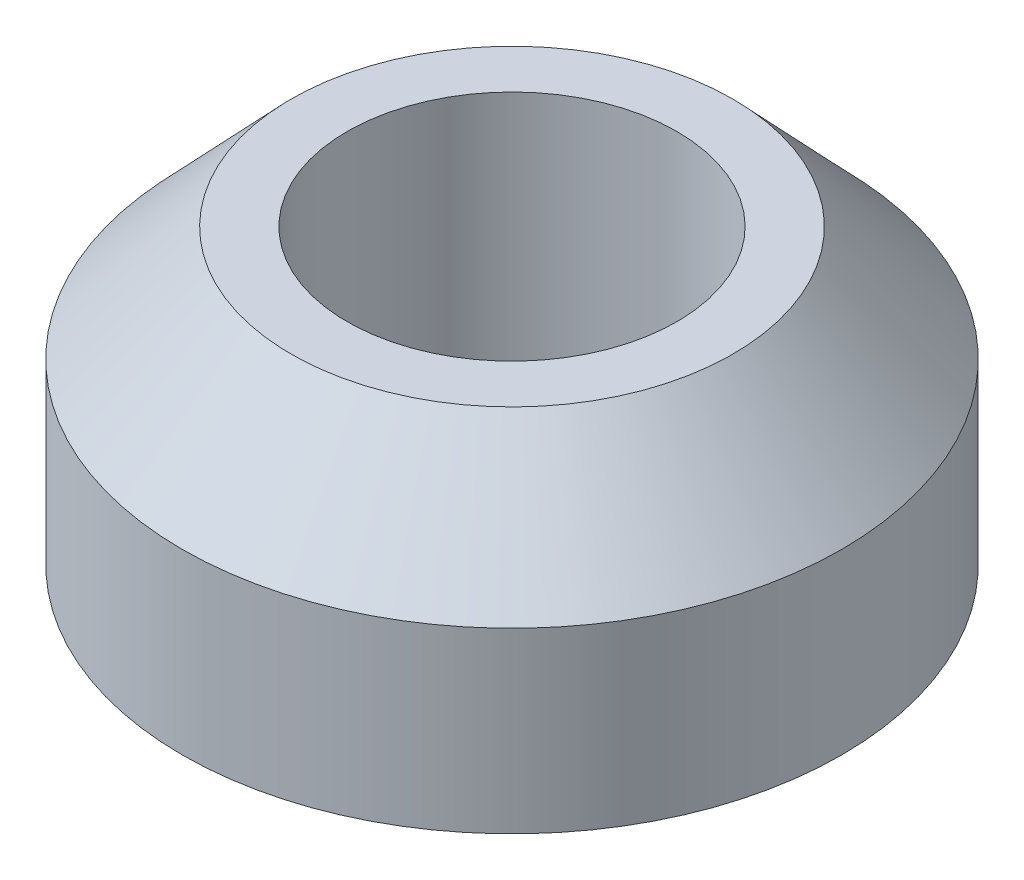
ISO-10303-21;
HEADER;
FILE_DESCRIPTION(('STEP AP214'),'2;1');
FILE_NAME('part.step','',(''),(''),'','','');
FILE_SCHEMA(('AUTOMOTIVE_DESIGN { 1 0 10303 214 1 1 1 1 }'));
ENDSEC;
DATA;
#1=APPLICATION_CONTEXT('core data for automotive mechanical design processes');
#2=APPLICATION_PROTOCOL_DEFINITION('international standard','automotive_design',2000,#1);
#3=PRODUCT_CONTEXT('',#1,'mechanical');
#4=PRODUCT('Part','Part','',(#3));
#5=PRODUCT_RELATED_PRODUCT_CATEGORY('part','',(#4));
#6=PRODUCT_DEFINITION_FORMATION('','',#4);
#7=PRODUCT_DEFINITION_CONTEXT('part definition',#1,'design');
#8=PRODUCT_DEFINITION('design','',#6,#7);
#9=PRODUCT_DEFINITION_SHAPE('','',#8);
#10=(LENGTH_UNIT() NAMED_UNIT(*) SI_UNIT(.MILLI.,.METRE.));
#11=(NAMED_UNIT(*) PLANE_ANGLE_UNIT() SI_UNIT($,.RADIAN.));
#12=(NAMED_UNIT(*) SI_UNIT($,.STERADIAN.) SOLID_ANGLE_UNIT());
#13=UNCERTAINTY_MEASURE_WITH_UNIT(LENGTH_MEASURE(1.E-05),#10,'distance_accuracy_value','');
#14=(GEOMETRIC_REPRESENTATION_CONTEXT(3) GLOBAL_UNCERTAINTY_ASSIGNED_CONTEXT((#13)) GLOBAL_UNIT_ASSIGNED_CONTEXT((#10,
#11,#12)) REPRESENTATION_CONTEXT('',''));
#15=CARTESIAN_POINT('',(0.,0.,0.));
#16=DIRECTION('',(0.,0.,1.));
#17=DIRECTION('',(1.,0.,0.));
#18=AXIS2_PLACEMENT_3D('',#15,#16,#17);
#19=CARTESIAN_POINT('',(0.,0.,-6.35));
#20=DIRECTION('',(0.,-1.,0.));
#21=DIRECTION('',(0.,0.,-1.));
#22=AXIS2_PLACEMENT_3D('',#19,#20,#21);
#23=PLANE('',#22);
#24=CARTESIAN_POINT('',(0.,0.,0.));
#25=DIRECTION('',(0.,-1.,0.));
#26=DIRECTION('',(0.,0.,-1.));
#27=AXIS2_PLACEMENT_3D('',#24,#25,#26);
#28=CIRCLE('',#27,6.35);
#29=CARTESIAN_POINT('',(0.,0.,-6.35));
#30=VERTEX_POINT('',#29);
#31=EDGE_CURVE('E66',#30,#30,#28,.T.);
#32=ORIENTED_EDGE('',*,*,#31,.T.);
#33=EDGE_LOOP('',(#32));
#34=FACE_BOUND('',#33,.T.);
#35=CARTESIAN_POINT('',(0.,0.,0.));
#36=DIRECTION('',(0.,-1.,0.));
#37=DIRECTION('',(0.,0.,-1.));
#38=AXIS2_PLACEMENT_3D('',#35,#36,#37);
#39=CIRCLE('',#38,3.175);
#40=CARTESIAN_POINT('',(0.,0.,-3.175));
#41=VERTEX_POINT('',#40);
#42=EDGE_CURVE('E10',#41,#41,#39,.T.);
#43=ORIENTED_EDGE('',*,*,#42,.F.);
#44=EDGE_LOOP('',(#43));
#45=FACE_BOUND('',#44,.T.);
#46=ADVANCED_FACE('F43',(#34,#45),#23,.T.);
#47=CARTESIAN_POINT('',(0.,0.,0.));
#48=DIRECTION('',(0.,-1.,0.));
#49=DIRECTION('',(0.,0.,-1.));
#50=AXIS2_PLACEMENT_3D('',#47,#48,#49);
#51=CYLINDRICAL_SURFACE('',#50,3.175);
#52=ORIENTED_EDGE('',*,*,#42,.T.);
#53=EDGE_LOOP('',(#52));
#54=FACE_BOUND('',#53,.T.);
#55=CARTESIAN_POINT('',(0.,5.6388,0.));
#56=DIRECTION('',(0.,-1.,0.));
#57=DIRECTION('',(0.,0.,-1.));
#58=AXIS2_PLACEMENT_3D('',#55,#56,#57);
#59=CIRCLE('',#58,3.175);
#60=CARTESIAN_POINT('',(0.,5.6388,-3.175));
#61=VERTEX_POINT('',#60);
#62=EDGE_CURVE('E50',#61,#61,#59,.T.);
#63=ORIENTED_EDGE('',*,*,#62,.F.);
#64=EDGE_LOOP('',(#63));
#65=FACE_BOUND('',#64,.T.);
#66=ADVANCED_FACE('F85',(#54,#65),#51,.F.);
#67=CARTESIAN_POINT('',(0.,5.6388,-3.175));
#68=DIRECTION('',(0.,1.,0.));
#69=DIRECTION('',(0.,0.,1.));
#70=AXIS2_PLACEMENT_3D('',#67,#68,#69);
#71=PLANE('',#70);
#72=ORIENTED_EDGE('',*,*,#62,.T.);
#73=EDGE_LOOP('',(#72));
#74=FACE_BOUND('',#73,.T.);
#75=CARTESIAN_POINT('',(0.,5.6388,0.));
#76=DIRECTION('',(0.,-1.,0.));
#77=DIRECTION('',(0.,0.,-1.));
#78=AXIS2_PLACEMENT_3D('',#75,#76,#77);
#79=CIRCLE('',#78,4.2545);
#80=CARTESIAN_POINT('',(0.,5.6388,-4.2545));
#81=VERTEX_POINT('',#80);
#82=EDGE_CURVE('E55',#81,#81,#79,.T.);
#83=ORIENTED_EDGE('',*,*,#82,.F.);
#84=EDGE_LOOP('',(#83));
#85=FACE_BOUND('',#84,.T.);
#86=ADVANCED_FACE('F81',(#74,#85),#71,.T.);
#87=CARTESIAN_POINT('',(0.,3.429,0.));
#88=DIRECTION('',(0.,-1.,0.));
#89=DIRECTION('',(0.,0.,-1.));
#90=AXIS2_PLACEMENT_3D('',#87,#88,#89);
#91=CONICAL_SURFACE('',#90,6.35,0.758855725646051);
#92=ORIENTED_EDGE('',*,*,#82,.T.);
#93=EDGE_LOOP('',(#92));
#94=FACE_BOUND('',#93,.T.);
#95=CARTESIAN_POINT('',(0.,3.429,0.));
#96=DIRECTION('',(0.,-1.,0.));
#97=DIRECTION('',(0.,0.,-1.));
#98=AXIS2_PLACEMENT_3D('',#95,#96,#97);
#99=CIRCLE('',#98,6.35);
#100=CARTESIAN_POINT('',(0.,3.429,-6.35));
#101=VERTEX_POINT('',#100);
#102=EDGE_CURVE('E60',#101,#101,#99,.T.);
#103=ORIENTED_EDGE('',*,*,#102,.F.);
#104=EDGE_LOOP('',(#103));
#105=FACE_BOUND('',#104,.T.);
#106=ADVANCED_FACE('F75',(#94,#105),#91,.T.);
#107=CARTESIAN_POINT('',(0.,0.,0.));
#108=DIRECTION('',(0.,-1.,0.));
#109=DIRECTION('',(0.,0.,-1.));
#110=AXIS2_PLACEMENT_3D('',#107,#108,#109);
#111=CYLINDRICAL_SURFACE('',#110,6.35);
#112=ORIENTED_EDGE('',*,*,#102,.T.);
#113=EDGE_LOOP('',(#112));
#114=FACE_BOUND('',#113,.T.);
#115=ORIENTED_EDGE('',*,*,#31,.F.);
#116=EDGE_LOOP('',(#115));
#117=FACE_BOUND('',#116,.T.);
#118=ADVANCED_FACE('F73',(#114,#117),#111,.T.);
#119=CLOSED_SHELL('',(#46,#66,#86,#106,#118));
#120=MANIFOLD_SOLID_BREP('B2',#119);
#121=ADVANCED_BREP_SHAPE_REPRESENTATION('',(#18,#120),#14);
#122=SHAPE_DEFINITION_REPRESENTATION(#9,#121);
ENDSEC;
END-ISO-10303-21;
